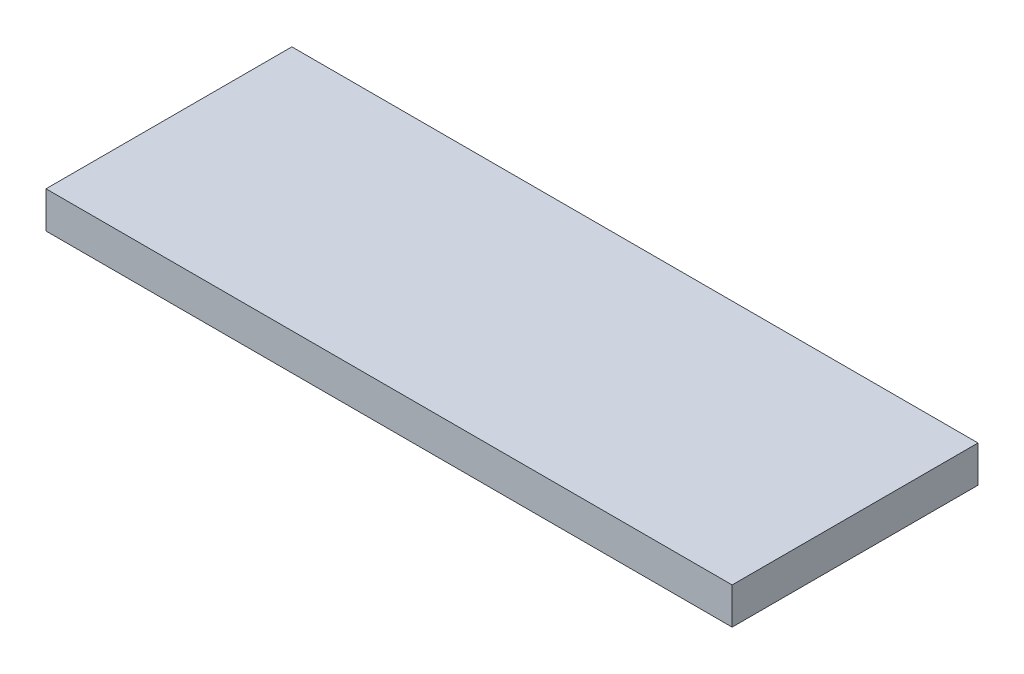
ISO-10303-21;
HEADER;
FILE_DESCRIPTION(('STEP AP214'),'2;1');
FILE_NAME('part.step','',(''),(''),'','','');
FILE_SCHEMA(('AUTOMOTIVE_DESIGN { 1 0 10303 214 1 1 1 1 }'));
ENDSEC;
DATA;
#1=APPLICATION_CONTEXT('core data for automotive mechanical design processes');
#2=APPLICATION_PROTOCOL_DEFINITION('international standard','automotive_design',2000,#1);
#3=PRODUCT_CONTEXT('',#1,'mechanical');
#4=PRODUCT('Part','Part','',(#3));
#5=PRODUCT_RELATED_PRODUCT_CATEGORY('part','',(#4));
#6=PRODUCT_DEFINITION_FORMATION('','',#4);
#7=PRODUCT_DEFINITION_CONTEXT('part definition',#1,'design');
#8=PRODUCT_DEFINITION('design','',#6,#7);
#9=PRODUCT_DEFINITION_SHAPE('','',#8);
#10=(LENGTH_UNIT() NAMED_UNIT(*) SI_UNIT(.MILLI.,.METRE.));
#11=(NAMED_UNIT(*) PLANE_ANGLE_UNIT() SI_UNIT($,.RADIAN.));
#12=(NAMED_UNIT(*) SI_UNIT($,.STERADIAN.) SOLID_ANGLE_UNIT());
#13=UNCERTAINTY_MEASURE_WITH_UNIT(LENGTH_MEASURE(1.E-05),#10,'distance_accuracy_value','');
#14=(GEOMETRIC_REPRESENTATION_CONTEXT(3) GLOBAL_UNCERTAINTY_ASSIGNED_CONTEXT((#13)) GLOBAL_UNIT_ASSIGNED_CONTEXT((#10,
#11,#12)) REPRESENTATION_CONTEXT('',''));
#15=CARTESIAN_POINT('',(0.,0.,0.));
#16=DIRECTION('',(0.,0.,1.));
#17=DIRECTION('',(1.,0.,0.));
#18=AXIS2_PLACEMENT_3D('',#15,#16,#17);
#19=CARTESIAN_POINT('',(0.,1.6,0.));
#20=DIRECTION('',(1.,0.,0.));
#21=DIRECTION('',(0.,0.,-1.));
#22=AXIS2_PLACEMENT_3D('',#19,#20,#21);
#23=PLANE('',#22);
#24=DIRECTION('',(0.,0.,1.));
#25=VECTOR('',#24,1.);
#26=CARTESIAN_POINT('',(0.,0.,0.));
#27=LINE('',#26,#25);
#28=CARTESIAN_POINT('',(0.,0.,-10.75));
#29=VERTEX_POINT('',#28);
#30=CARTESIAN_POINT('',(0.,0.,0.));
#31=VERTEX_POINT('',#30);
#32=EDGE_CURVE('E95',#29,#31,#27,.T.);
#33=ORIENTED_EDGE('',*,*,#32,.T.);
#34=DIRECTION('',(0.,-1.,0.));
#35=VECTOR('',#34,1.);
#36=CARTESIAN_POINT('',(0.,1.6,0.));
#37=LINE('',#36,#35);
#38=CARTESIAN_POINT('',(0.,1.6,0.));
#39=VERTEX_POINT('',#38);
#40=EDGE_CURVE('E11',#39,#31,#37,.T.);
#41=ORIENTED_EDGE('',*,*,#40,.F.);
#42=DIRECTION('',(0.,0.,1.));
#43=VECTOR('',#42,1.);
#44=CARTESIAN_POINT('',(0.,1.6,0.));
#45=LINE('',#44,#43);
#46=CARTESIAN_POINT('',(0.,1.6,-10.75));
#47=VERTEX_POINT('',#46);
#48=EDGE_CURVE('E83',#47,#39,#45,.T.);
#49=ORIENTED_EDGE('',*,*,#48,.F.);
#50=DIRECTION('',(0.,-1.,0.));
#51=VECTOR('',#50,1.);
#52=CARTESIAN_POINT('',(0.,1.6,-10.75));
#53=LINE('',#52,#51);
#54=EDGE_CURVE('E91',#47,#29,#53,.T.);
#55=ORIENTED_EDGE('',*,*,#54,.T.);
#56=EDGE_LOOP('',(#33,#41,#49,#55));
#57=FACE_BOUND('',#56,.T.);
#58=ADVANCED_FACE('F32',(#57),#23,.F.);
#59=CARTESIAN_POINT('',(0.,1.6,0.));
#60=DIRECTION('',(0.,0.,-1.));
#61=DIRECTION('',(-1.,0.,0.));
#62=AXIS2_PLACEMENT_3D('',#59,#60,#61);
#63=PLANE('',#62);
#64=DIRECTION('',(1.,0.,0.));
#65=VECTOR('',#64,1.);
#66=CARTESIAN_POINT('',(0.,0.,0.));
#67=LINE('',#66,#65);
#68=CARTESIAN_POINT('',(30.,0.,0.));
#69=VERTEX_POINT('',#68);
#70=EDGE_CURVE('E87',#31,#69,#67,.T.);
#71=ORIENTED_EDGE('',*,*,#70,.T.);
#72=DIRECTION('',(0.,-1.,0.));
#73=VECTOR('',#72,1.);
#74=CARTESIAN_POINT('',(30.,1.6,0.));
#75=LINE('',#74,#73);
#76=CARTESIAN_POINT('',(30.,1.6,0.));
#77=VERTEX_POINT('',#76);
#78=EDGE_CURVE('E40',#77,#69,#75,.T.);
#79=ORIENTED_EDGE('',*,*,#78,.F.);
#80=DIRECTION('',(1.,0.,0.));
#81=VECTOR('',#80,1.);
#82=CARTESIAN_POINT('',(0.,1.6,0.));
#83=LINE('',#82,#81);
#84=EDGE_CURVE('E78',#39,#77,#83,.T.);
#85=ORIENTED_EDGE('',*,*,#84,.F.);
#86=ORIENTED_EDGE('',*,*,#40,.T.);
#87=EDGE_LOOP('',(#71,#79,#85,#86));
#88=FACE_BOUND('',#87,.T.);
#89=ADVANCED_FACE('F86',(#88),#63,.F.);
#90=CARTESIAN_POINT('',(30.,1.6,0.));
#91=DIRECTION('',(-1.,0.,0.));
#92=DIRECTION('',(0.,0.,1.));
#93=AXIS2_PLACEMENT_3D('',#90,#91,#92);
#94=PLANE('',#93);
#95=DIRECTION('',(0.,0.,-1.));
#96=VECTOR('',#95,1.);
#97=CARTESIAN_POINT('',(30.,0.,0.));
#98=LINE('',#97,#96);
#99=CARTESIAN_POINT('',(30.,0.,-10.75));
#100=VERTEX_POINT('',#99);
#101=EDGE_CURVE('E65',#69,#100,#98,.T.);
#102=ORIENTED_EDGE('',*,*,#101,.T.);
#103=DIRECTION('',(0.,-1.,0.));
#104=VECTOR('',#103,1.);
#105=CARTESIAN_POINT('',(30.,1.6,-10.75));
#106=LINE('',#105,#104);
#107=CARTESIAN_POINT('',(30.,1.6,-10.75));
#108=VERTEX_POINT('',#107);
#109=EDGE_CURVE('E88',#108,#100,#106,.T.);
#110=ORIENTED_EDGE('',*,*,#109,.F.);
#111=DIRECTION('',(0.,0.,-1.));
#112=VECTOR('',#111,1.);
#113=CARTESIAN_POINT('',(30.,1.6,0.));
#114=LINE('',#113,#112);
#115=EDGE_CURVE('E81',#77,#108,#114,.T.);
#116=ORIENTED_EDGE('',*,*,#115,.F.);
#117=ORIENTED_EDGE('',*,*,#78,.T.);
#118=EDGE_LOOP('',(#102,#110,#116,#117));
#119=FACE_BOUND('',#118,.T.);
#120=ADVANCED_FACE('F89',(#119),#94,.F.);
#121=CARTESIAN_POINT('',(0.,1.6,-10.75));
#122=DIRECTION('',(0.,0.,1.));
#123=DIRECTION('',(1.,0.,0.));
#124=AXIS2_PLACEMENT_3D('',#121,#122,#123);
#125=PLANE('',#124);
#126=DIRECTION('',(-1.,0.,0.));
#127=VECTOR('',#126,1.);
#128=CARTESIAN_POINT('',(0.,0.,-10.75));
#129=LINE('',#128,#127);
#130=EDGE_CURVE('E71',#100,#29,#129,.T.);
#131=ORIENTED_EDGE('',*,*,#130,.T.);
#132=ORIENTED_EDGE('',*,*,#54,.F.);
#133=DIRECTION('',(-1.,0.,0.));
#134=VECTOR('',#133,1.);
#135=CARTESIAN_POINT('',(0.,1.6,-10.75));
#136=LINE('',#135,#134);
#137=EDGE_CURVE('E48',#108,#47,#136,.T.);
#138=ORIENTED_EDGE('',*,*,#137,.F.);
#139=ORIENTED_EDGE('',*,*,#109,.T.);
#140=EDGE_LOOP('',(#131,#132,#138,#139));
#141=FACE_BOUND('',#140,.T.);
#142=ADVANCED_FACE('F102',(#141),#125,.F.);
#143=CARTESIAN_POINT('',(0.,1.6,0.));
#144=DIRECTION('',(0.,-1.,0.));
#145=DIRECTION('',(0.,0.,-1.));
#146=AXIS2_PLACEMENT_3D('',#143,#144,#145);
#147=PLANE('',#146);
#148=ORIENTED_EDGE('',*,*,#48,.T.);
#149=ORIENTED_EDGE('',*,*,#84,.T.);
#150=ORIENTED_EDGE('',*,*,#115,.T.);
#151=ORIENTED_EDGE('',*,*,#137,.T.);
#152=EDGE_LOOP('',(#148,#149,#150,#151));
#153=FACE_BOUND('',#152,.T.);
#154=ADVANCED_FACE('F79',(#153),#147,.F.);
#155=CARTESIAN_POINT('',(0.,0.,0.));
#156=DIRECTION('',(0.,-1.,0.));
#157=DIRECTION('',(0.,0.,-1.));
#158=AXIS2_PLACEMENT_3D('',#155,#156,#157);
#159=PLANE('',#158);
#160=ORIENTED_EDGE('',*,*,#32,.F.);
#161=ORIENTED_EDGE('',*,*,#130,.F.);
#162=ORIENTED_EDGE('',*,*,#101,.F.);
#163=ORIENTED_EDGE('',*,*,#70,.F.);
#164=EDGE_LOOP('',(#160,#161,#162,#163));
#165=FACE_BOUND('',#164,.T.);
#166=ADVANCED_FACE('F105',(#165),#159,.T.);
#167=CLOSED_SHELL('',(#58,#89,#120,#142,#154,#166));
#168=MANIFOLD_SOLID_BREP('B2',#167);
#169=ADVANCED_BREP_SHAPE_REPRESENTATION('',(#18,#168),#14);
#170=SHAPE_DEFINITION_REPRESENTATION(#9,#169);
ENDSEC;
END-ISO-10303-21;
